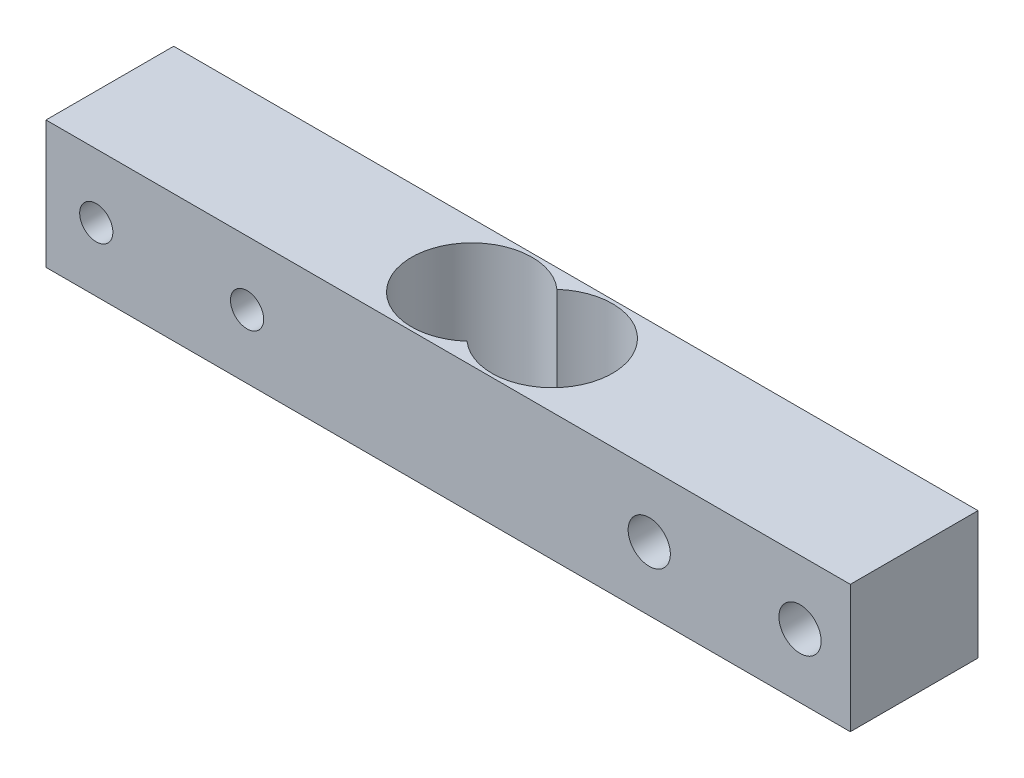
ISO-10303-21;
HEADER;
FILE_DESCRIPTION(('STEP AP214'),'2;1');
FILE_NAME('part.step','',(''),(''),'','','');
FILE_SCHEMA(('AUTOMOTIVE_DESIGN { 1 0 10303 214 1 1 1 1 }'));
ENDSEC;
DATA;
#1=APPLICATION_CONTEXT('core data for automotive mechanical design processes');
#2=APPLICATION_PROTOCOL_DEFINITION('international standard','automotive_design',2000,#1);
#3=PRODUCT_CONTEXT('',#1,'mechanical');
#4=PRODUCT('Part','Part','',(#3));
#5=PRODUCT_RELATED_PRODUCT_CATEGORY('part','',(#4));
#6=PRODUCT_DEFINITION_FORMATION('','',#4);
#7=PRODUCT_DEFINITION_CONTEXT('part definition',#1,'design');
#8=PRODUCT_DEFINITION('design','',#6,#7);
#9=PRODUCT_DEFINITION_SHAPE('','',#8);
#10=(LENGTH_UNIT() NAMED_UNIT(*) SI_UNIT(.MILLI.,.METRE.));
#11=(NAMED_UNIT(*) PLANE_ANGLE_UNIT() SI_UNIT($,.RADIAN.));
#12=(NAMED_UNIT(*) SI_UNIT($,.STERADIAN.) SOLID_ANGLE_UNIT());
#13=UNCERTAINTY_MEASURE_WITH_UNIT(LENGTH_MEASURE(1.E-05),#10,'distance_accuracy_value','');
#14=(GEOMETRIC_REPRESENTATION_CONTEXT(3) GLOBAL_UNCERTAINTY_ASSIGNED_CONTEXT((#13)) GLOBAL_UNIT_ASSIGNED_CONTEXT((#10,
#11,#12)) REPRESENTATION_CONTEXT('',''));
#15=CARTESIAN_POINT('',(0.,0.,0.));
#16=DIRECTION('',(0.,0.,1.));
#17=DIRECTION('',(1.,0.,0.));
#18=AXIS2_PLACEMENT_3D('',#15,#16,#17);
#19=CARTESIAN_POINT('',(-40.,-6.35,-12.7));
#20=DIRECTION('',(1.,0.,0.));
#21=DIRECTION('',(0.,0.,-1.));
#22=AXIS2_PLACEMENT_3D('',#19,#20,#21);
#23=PLANE('',#22);
#24=DIRECTION('',(0.,1.,0.));
#25=VECTOR('',#24,1.);
#26=CARTESIAN_POINT('',(-40.,-6.35,0.));
#27=LINE('',#26,#25);
#28=CARTESIAN_POINT('',(-40.,-6.35,0.));
#29=VERTEX_POINT('',#28);
#30=CARTESIAN_POINT('',(-40.,6.35,0.));
#31=VERTEX_POINT('',#30);
#32=EDGE_CURVE('E136',#29,#31,#27,.T.);
#33=ORIENTED_EDGE('',*,*,#32,.T.);
#34=DIRECTION('',(0.,0.,1.));
#35=VECTOR('',#34,1.);
#36=CARTESIAN_POINT('',(-40.,6.35,-12.7));
#37=LINE('',#36,#35);
#38=CARTESIAN_POINT('',(-40.,6.35,-12.7));
#39=VERTEX_POINT('',#38);
#40=EDGE_CURVE('E12',#39,#31,#37,.T.);
#41=ORIENTED_EDGE('',*,*,#40,.F.);
#42=DIRECTION('',(0.,1.,0.));
#43=VECTOR('',#42,1.);
#44=CARTESIAN_POINT('',(-40.,-6.35,-12.7));
#45=LINE('',#44,#43);
#46=CARTESIAN_POINT('',(-40.,-6.35,-12.7));
#47=VERTEX_POINT('',#46);
#48=EDGE_CURVE('E137',#47,#39,#45,.T.);
#49=ORIENTED_EDGE('',*,*,#48,.F.);
#50=DIRECTION('',(0.,0.,1.));
#51=VECTOR('',#50,1.);
#52=CARTESIAN_POINT('',(-40.,-6.35,-12.7));
#53=LINE('',#52,#51);
#54=EDGE_CURVE('E149',#47,#29,#53,.T.);
#55=ORIENTED_EDGE('',*,*,#54,.T.);
#56=EDGE_LOOP('',(#33,#41,#49,#55));
#57=FACE_BOUND('',#56,.T.);
#58=ADVANCED_FACE('F43',(#57),#23,.F.);
#59=CARTESIAN_POINT('',(-40.,6.35,-12.7));
#60=DIRECTION('',(0.,-1.,0.));
#61=DIRECTION('',(0.,0.,-1.));
#62=AXIS2_PLACEMENT_3D('',#59,#60,#61);
#63=PLANE('',#62);
#64=CARTESIAN_POINT('',(4.,6.35,-6.35));
#65=DIRECTION('',(0.,1.,0.));
#66=DIRECTION('',(0.,0.,1.));
#67=AXIS2_PLACEMENT_3D('',#64,#65,#66);
#68=CIRCLE('',#67,6.);
#69=CARTESIAN_POINT('',(0.,6.35,-1.87786404500042));
#70=VERTEX_POINT('',#69);
#71=CARTESIAN_POINT('',(0.,6.35,-10.8221359549996));
#72=VERTEX_POINT('',#71);
#73=EDGE_CURVE('E101',#70,#72,#68,.T.);
#74=ORIENTED_EDGE('',*,*,#73,.F.);
#75=CARTESIAN_POINT('',(-4.,6.35,-6.35));
#76=DIRECTION('',(0.,1.,0.));
#77=DIRECTION('',(0.,0.,1.));
#78=AXIS2_PLACEMENT_3D('',#75,#76,#77);
#79=CIRCLE('',#78,6.);
#80=EDGE_CURVE('E57',#72,#70,#79,.T.);
#81=ORIENTED_EDGE('',*,*,#80,.F.);
#82=EDGE_LOOP('',(#74,#81));
#83=FACE_BOUND('',#82,.T.);
#84=DIRECTION('',(1.,0.,0.));
#85=VECTOR('',#84,1.);
#86=CARTESIAN_POINT('',(-40.,6.35,0.));
#87=LINE('',#86,#85);
#88=CARTESIAN_POINT('',(40.,6.35,0.));
#89=VERTEX_POINT('',#88);
#90=EDGE_CURVE('E152',#31,#89,#87,.T.);
#91=ORIENTED_EDGE('',*,*,#90,.T.);
#92=DIRECTION('',(0.,0.,1.));
#93=VECTOR('',#92,1.);
#94=CARTESIAN_POINT('',(40.,6.35,-12.7));
#95=LINE('',#94,#93);
#96=CARTESIAN_POINT('',(40.,6.35,-12.7));
#97=VERTEX_POINT('',#96);
#98=EDGE_CURVE('E50',#97,#89,#95,.T.);
#99=ORIENTED_EDGE('',*,*,#98,.F.);
#100=DIRECTION('',(1.,0.,0.));
#101=VECTOR('',#100,1.);
#102=CARTESIAN_POINT('',(-40.,6.35,-12.7));
#103=LINE('',#102,#101);
#104=EDGE_CURVE('E140',#39,#97,#103,.T.);
#105=ORIENTED_EDGE('',*,*,#104,.F.);
#106=ORIENTED_EDGE('',*,*,#40,.T.);
#107=EDGE_LOOP('',(#91,#99,#105,#106));
#108=FACE_BOUND('',#107,.T.);
#109=ADVANCED_FACE('F106',(#83,#108),#63,.F.);
#110=CARTESIAN_POINT('',(40.,-6.35,-12.7));
#111=DIRECTION('',(1.,0.,0.));
#112=DIRECTION('',(0.,0.,-1.));
#113=AXIS2_PLACEMENT_3D('',#110,#111,#112);
#114=PLANE('',#113);
#115=DIRECTION('',(0.,1.,0.));
#116=VECTOR('',#115,1.);
#117=CARTESIAN_POINT('',(40.,-6.35,0.));
#118=LINE('',#117,#116);
#119=CARTESIAN_POINT('',(40.,-6.35,0.));
#120=VERTEX_POINT('',#119);
#121=EDGE_CURVE('E155',#120,#89,#118,.T.);
#122=ORIENTED_EDGE('',*,*,#121,.F.);
#123=DIRECTION('',(0.,0.,1.));
#124=VECTOR('',#123,1.);
#125=CARTESIAN_POINT('',(40.,-6.35,-12.7));
#126=LINE('',#125,#124);
#127=CARTESIAN_POINT('',(40.,-6.35,-12.7));
#128=VERTEX_POINT('',#127);
#129=EDGE_CURVE('E161',#128,#120,#126,.T.);
#130=ORIENTED_EDGE('',*,*,#129,.F.);
#131=DIRECTION('',(0.,1.,0.));
#132=VECTOR('',#131,1.);
#133=CARTESIAN_POINT('',(40.,-6.35,-12.7));
#134=LINE('',#133,#132);
#135=EDGE_CURVE('E143',#128,#97,#134,.T.);
#136=ORIENTED_EDGE('',*,*,#135,.T.);
#137=ORIENTED_EDGE('',*,*,#98,.T.);
#138=EDGE_LOOP('',(#122,#130,#136,#137));
#139=FACE_BOUND('',#138,.T.);
#140=ADVANCED_FACE('F165',(#139),#114,.T.);
#141=CARTESIAN_POINT('',(-40.,-6.35,-12.7));
#142=DIRECTION('',(0.,-1.,0.));
#143=DIRECTION('',(0.,0.,-1.));
#144=AXIS2_PLACEMENT_3D('',#141,#142,#143);
#145=PLANE('',#144);
#146=CARTESIAN_POINT('',(-4.,-6.35,-6.35));
#147=DIRECTION('',(0.,1.,0.));
#148=DIRECTION('',(0.,0.,1.));
#149=AXIS2_PLACEMENT_3D('',#146,#147,#148);
#150=CIRCLE('',#149,6.);
#151=CARTESIAN_POINT('',(0.,-6.35,-10.8221359549996));
#152=VERTEX_POINT('',#151);
#153=CARTESIAN_POINT('',(0.,-6.35,-1.87786404500042));
#154=VERTEX_POINT('',#153);
#155=EDGE_CURVE('E62',#152,#154,#150,.T.);
#156=ORIENTED_EDGE('',*,*,#155,.T.);
#157=CARTESIAN_POINT('',(4.,-6.35,-6.35));
#158=DIRECTION('',(0.,1.,0.));
#159=DIRECTION('',(0.,0.,1.));
#160=AXIS2_PLACEMENT_3D('',#157,#158,#159);
#161=CIRCLE('',#160,6.);
#162=EDGE_CURVE('E104',#154,#152,#161,.T.);
#163=ORIENTED_EDGE('',*,*,#162,.T.);
#164=EDGE_LOOP('',(#156,#163));
#165=FACE_BOUND('',#164,.T.);
#166=DIRECTION('',(1.,0.,0.));
#167=VECTOR('',#166,1.);
#168=CARTESIAN_POINT('',(-40.,-6.35,0.));
#169=LINE('',#168,#167);
#170=EDGE_CURVE('E141',#29,#120,#169,.T.);
#171=ORIENTED_EDGE('',*,*,#170,.F.);
#172=ORIENTED_EDGE('',*,*,#54,.F.);
#173=DIRECTION('',(1.,0.,0.));
#174=VECTOR('',#173,1.);
#175=CARTESIAN_POINT('',(-40.,-6.35,-12.7));
#176=LINE('',#175,#174);
#177=EDGE_CURVE('E146',#47,#128,#176,.T.);
#178=ORIENTED_EDGE('',*,*,#177,.T.);
#179=ORIENTED_EDGE('',*,*,#129,.T.);
#180=EDGE_LOOP('',(#171,#172,#178,#179));
#181=FACE_BOUND('',#180,.T.);
#182=ADVANCED_FACE('F173',(#165,#181),#145,.T.);
#183=CARTESIAN_POINT('',(0.,0.,-12.7));
#184=DIRECTION('',(0.,0.,-1.));
#185=DIRECTION('',(-1.,0.,0.));
#186=AXIS2_PLACEMENT_3D('',#183,#184,#185);
#187=PLANE('',#186);
#188=CARTESIAN_POINT('',(-35.,0.,-12.7));
#189=DIRECTION('',(0.,0.,1.));
#190=DIRECTION('',(1.,0.,0.));
#191=AXIS2_PLACEMENT_3D('',#188,#189,#190);
#192=CIRCLE('',#191,1.65);
#193=CARTESIAN_POINT('',(-33.35,0.,-12.7));
#194=VERTEX_POINT('',#193);
#195=EDGE_CURVE('E115',#194,#194,#192,.T.);
#196=ORIENTED_EDGE('',*,*,#195,.T.);
#197=EDGE_LOOP('',(#196));
#198=FACE_BOUND('',#197,.T.);
#199=CARTESIAN_POINT('',(-20.,0.,-12.7));
#200=DIRECTION('',(0.,0.,1.));
#201=DIRECTION('',(1.,0.,0.));
#202=AXIS2_PLACEMENT_3D('',#199,#200,#201);
#203=CIRCLE('',#202,1.65);
#204=CARTESIAN_POINT('',(-18.35,0.,-12.7));
#205=VERTEX_POINT('',#204);
#206=EDGE_CURVE('E121',#205,#205,#203,.T.);
#207=ORIENTED_EDGE('',*,*,#206,.T.);
#208=EDGE_LOOP('',(#207));
#209=FACE_BOUND('',#208,.T.);
#210=CARTESIAN_POINT('',(20.,0.,-12.7));
#211=DIRECTION('',(0.,0.,1.));
#212=DIRECTION('',(1.,0.,0.));
#213=AXIS2_PLACEMENT_3D('',#210,#211,#212);
#214=CIRCLE('',#213,2.1);
#215=CARTESIAN_POINT('',(22.1,0.,-12.7));
#216=VERTEX_POINT('',#215);
#217=EDGE_CURVE('E127',#216,#216,#214,.T.);
#218=ORIENTED_EDGE('',*,*,#217,.T.);
#219=EDGE_LOOP('',(#218));
#220=FACE_BOUND('',#219,.T.);
#221=CARTESIAN_POINT('',(35.,0.,-12.7));
#222=DIRECTION('',(0.,0.,1.));
#223=DIRECTION('',(1.,0.,0.));
#224=AXIS2_PLACEMENT_3D('',#221,#222,#223);
#225=CIRCLE('',#224,2.1);
#226=CARTESIAN_POINT('',(37.1,0.,-12.7));
#227=VERTEX_POINT('',#226);
#228=EDGE_CURVE('E133',#227,#227,#225,.T.);
#229=ORIENTED_EDGE('',*,*,#228,.T.);
#230=EDGE_LOOP('',(#229));
#231=FACE_BOUND('',#230,.T.);
#232=ORIENTED_EDGE('',*,*,#48,.T.);
#233=ORIENTED_EDGE('',*,*,#104,.T.);
#234=ORIENTED_EDGE('',*,*,#135,.F.);
#235=ORIENTED_EDGE('',*,*,#177,.F.);
#236=EDGE_LOOP('',(#232,#233,#234,#235));
#237=FACE_BOUND('',#236,.T.);
#238=ADVANCED_FACE('F177',(#198,#209,#220,#231,#237),#187,.T.);
#239=CARTESIAN_POINT('',(0.,0.,0.));
#240=DIRECTION('',(0.,0.,-1.));
#241=DIRECTION('',(-1.,0.,0.));
#242=AXIS2_PLACEMENT_3D('',#239,#240,#241);
#243=PLANE('',#242);
#244=CARTESIAN_POINT('',(-35.,0.,0.));
#245=DIRECTION('',(0.,0.,1.));
#246=DIRECTION('',(1.,0.,0.));
#247=AXIS2_PLACEMENT_3D('',#244,#245,#246);
#248=CIRCLE('',#247,1.65);
#249=CARTESIAN_POINT('',(-33.35,0.,0.));
#250=VERTEX_POINT('',#249);
#251=EDGE_CURVE('E97',#250,#250,#248,.T.);
#252=ORIENTED_EDGE('',*,*,#251,.F.);
#253=EDGE_LOOP('',(#252));
#254=FACE_BOUND('',#253,.T.);
#255=CARTESIAN_POINT('',(-20.,0.,0.));
#256=DIRECTION('',(0.,0.,1.));
#257=DIRECTION('',(1.,0.,0.));
#258=AXIS2_PLACEMENT_3D('',#255,#256,#257);
#259=CIRCLE('',#258,1.65);
#260=CARTESIAN_POINT('',(-18.35,0.,0.));
#261=VERTEX_POINT('',#260);
#262=EDGE_CURVE('E118',#261,#261,#259,.T.);
#263=ORIENTED_EDGE('',*,*,#262,.F.);
#264=EDGE_LOOP('',(#263));
#265=FACE_BOUND('',#264,.T.);
#266=CARTESIAN_POINT('',(20.,0.,0.));
#267=DIRECTION('',(0.,0.,1.));
#268=DIRECTION('',(1.,0.,0.));
#269=AXIS2_PLACEMENT_3D('',#266,#267,#268);
#270=CIRCLE('',#269,2.1);
#271=CARTESIAN_POINT('',(22.1,0.,0.));
#272=VERTEX_POINT('',#271);
#273=EDGE_CURVE('E124',#272,#272,#270,.T.);
#274=ORIENTED_EDGE('',*,*,#273,.F.);
#275=EDGE_LOOP('',(#274));
#276=FACE_BOUND('',#275,.T.);
#277=CARTESIAN_POINT('',(35.,0.,0.));
#278=DIRECTION('',(0.,0.,1.));
#279=DIRECTION('',(1.,0.,0.));
#280=AXIS2_PLACEMENT_3D('',#277,#278,#279);
#281=CIRCLE('',#280,2.1);
#282=CARTESIAN_POINT('',(37.1,0.,0.));
#283=VERTEX_POINT('',#282);
#284=EDGE_CURVE('E130',#283,#283,#281,.T.);
#285=ORIENTED_EDGE('',*,*,#284,.F.);
#286=EDGE_LOOP('',(#285));
#287=FACE_BOUND('',#286,.T.);
#288=ORIENTED_EDGE('',*,*,#32,.F.);
#289=ORIENTED_EDGE('',*,*,#170,.T.);
#290=ORIENTED_EDGE('',*,*,#121,.T.);
#291=ORIENTED_EDGE('',*,*,#90,.F.);
#292=EDGE_LOOP('',(#288,#289,#290,#291));
#293=FACE_BOUND('',#292,.T.);
#294=ADVANCED_FACE('F170',(#254,#265,#276,#287,#293),#243,.F.);
#295=CARTESIAN_POINT('',(35.,0.,0.));
#296=DIRECTION('',(0.,0.,1.));
#297=DIRECTION('',(1.,0.,0.));
#298=AXIS2_PLACEMENT_3D('',#295,#296,#297);
#299=CYLINDRICAL_SURFACE('',#298,2.1);
#300=ORIENTED_EDGE('',*,*,#228,.F.);
#301=EDGE_LOOP('',(#300));
#302=FACE_BOUND('',#301,.T.);
#303=ORIENTED_EDGE('',*,*,#284,.T.);
#304=EDGE_LOOP('',(#303));
#305=FACE_BOUND('',#304,.T.);
#306=ADVANCED_FACE('F194',(#302,#305),#299,.F.);
#307=CARTESIAN_POINT('',(20.,0.,0.));
#308=DIRECTION('',(0.,0.,1.));
#309=DIRECTION('',(1.,0.,0.));
#310=AXIS2_PLACEMENT_3D('',#307,#308,#309);
#311=CYLINDRICAL_SURFACE('',#310,2.1);
#312=ORIENTED_EDGE('',*,*,#217,.F.);
#313=EDGE_LOOP('',(#312));
#314=FACE_BOUND('',#313,.T.);
#315=ORIENTED_EDGE('',*,*,#273,.T.);
#316=EDGE_LOOP('',(#315));
#317=FACE_BOUND('',#316,.T.);
#318=ADVANCED_FACE('F201',(#314,#317),#311,.F.);
#319=CARTESIAN_POINT('',(-20.,0.,0.));
#320=DIRECTION('',(0.,0.,1.));
#321=DIRECTION('',(1.,0.,0.));
#322=AXIS2_PLACEMENT_3D('',#319,#320,#321);
#323=CYLINDRICAL_SURFACE('',#322,1.65);
#324=ORIENTED_EDGE('',*,*,#206,.F.);
#325=EDGE_LOOP('',(#324));
#326=FACE_BOUND('',#325,.T.);
#327=ORIENTED_EDGE('',*,*,#262,.T.);
#328=EDGE_LOOP('',(#327));
#329=FACE_BOUND('',#328,.T.);
#330=ADVANCED_FACE('F205',(#326,#329),#323,.F.);
#331=CARTESIAN_POINT('',(-35.,0.,0.));
#332=DIRECTION('',(0.,0.,1.));
#333=DIRECTION('',(1.,0.,0.));
#334=AXIS2_PLACEMENT_3D('',#331,#332,#333);
#335=CYLINDRICAL_SURFACE('',#334,1.65);
#336=ORIENTED_EDGE('',*,*,#195,.F.);
#337=EDGE_LOOP('',(#336));
#338=FACE_BOUND('',#337,.T.);
#339=ORIENTED_EDGE('',*,*,#251,.T.);
#340=EDGE_LOOP('',(#339));
#341=FACE_BOUND('',#340,.T.);
#342=ADVANCED_FACE('F209',(#338,#341),#335,.F.);
#343=CARTESIAN_POINT('',(-4.,-6.35,-6.35));
#344=DIRECTION('',(0.,1.,0.));
#345=DIRECTION('',(0.,0.,1.));
#346=AXIS2_PLACEMENT_3D('',#343,#344,#345);
#347=CYLINDRICAL_SURFACE('',#346,6.);
#348=DIRECTION('',(0.,1.,0.));
#349=VECTOR('',#348,1.);
#350=CARTESIAN_POINT('',(0.,0.,-10.8221359549996));
#351=LINE('',#350,#349);
#352=EDGE_CURVE('E91',#152,#72,#351,.T.);
#353=ORIENTED_EDGE('',*,*,#352,.T.);
#354=ORIENTED_EDGE('',*,*,#80,.T.);
#355=DIRECTION('',(0.,1.,0.));
#356=VECTOR('',#355,1.);
#357=CARTESIAN_POINT('',(0.,0.,-1.87786404500042));
#358=LINE('',#357,#356);
#359=EDGE_CURVE('E98',#70,#154,#358,.F.);
#360=ORIENTED_EDGE('',*,*,#359,.T.);
#361=ORIENTED_EDGE('',*,*,#155,.F.);
#362=EDGE_LOOP('',(#353,#354,#360,#361));
#363=FACE_BOUND('',#362,.T.);
#364=ADVANCED_FACE('F93',(#363),#347,.F.);
#365=CARTESIAN_POINT('',(4.,-6.35,-6.35));
#366=DIRECTION('',(0.,1.,0.));
#367=DIRECTION('',(0.,0.,1.));
#368=AXIS2_PLACEMENT_3D('',#365,#366,#367);
#369=CYLINDRICAL_SURFACE('',#368,6.);
#370=ORIENTED_EDGE('',*,*,#162,.F.);
#371=ORIENTED_EDGE('',*,*,#359,.F.);
#372=ORIENTED_EDGE('',*,*,#73,.T.);
#373=ORIENTED_EDGE('',*,*,#352,.F.);
#374=EDGE_LOOP('',(#370,#371,#372,#373));
#375=FACE_BOUND('',#374,.T.);
#376=ADVANCED_FACE('F102',(#375),#369,.F.);
#377=CLOSED_SHELL('',(#58,#109,#140,#182,#238,#294,#306,#318,#330,#342,#364,#376));
#378=MANIFOLD_SOLID_BREP('B2',#377);
#379=ADVANCED_BREP_SHAPE_REPRESENTATION('',(#18,#378),#14);
#380=SHAPE_DEFINITION_REPRESENTATION(#9,#379);
ENDSEC;
END-ISO-10303-21;
